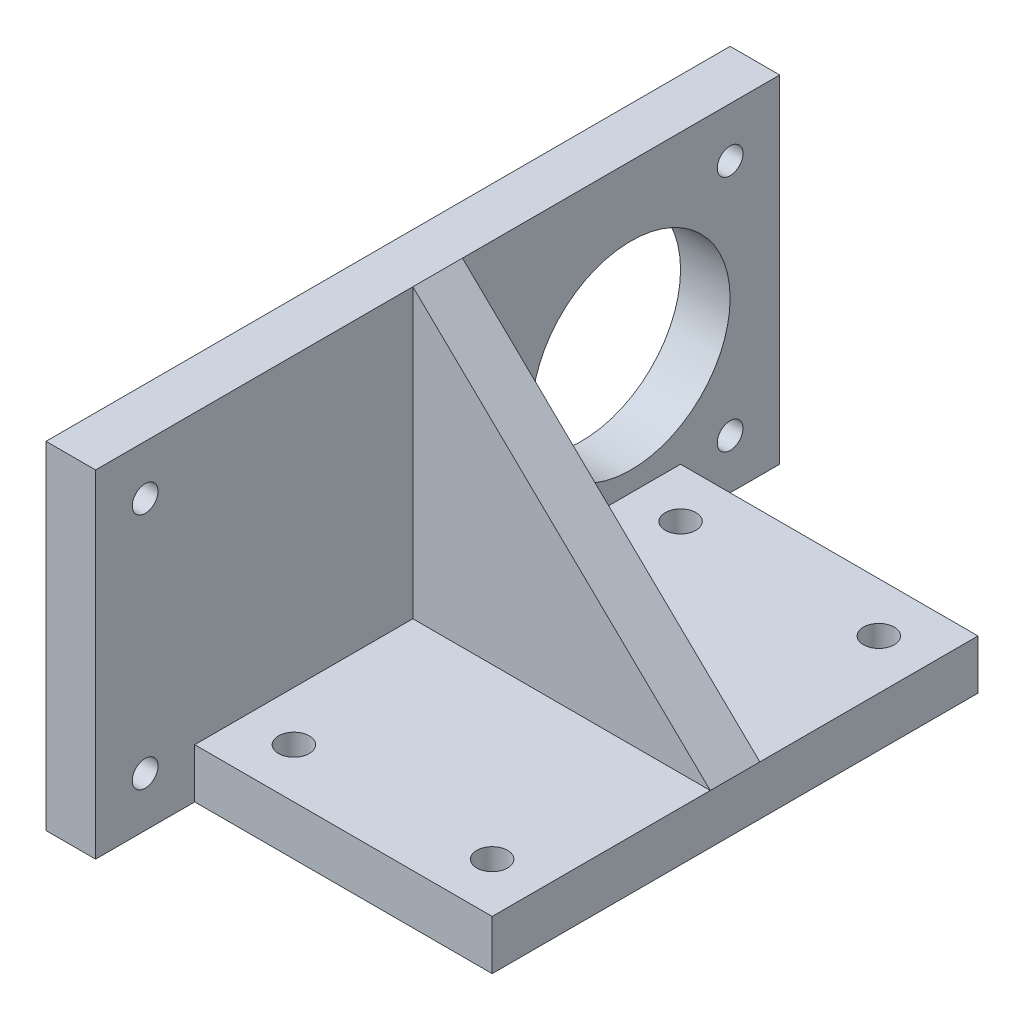
ISO-10303-21;
HEADER;
FILE_DESCRIPTION(('STEP AP214'),'2;1');
FILE_NAME('part.step','',(''),(''),'','','');
FILE_SCHEMA(('AUTOMOTIVE_DESIGN { 1 0 10303 214 1 1 1 1 }'));
ENDSEC;
DATA;
#1=APPLICATION_CONTEXT('core data for automotive mechanical design processes');
#2=APPLICATION_PROTOCOL_DEFINITION('international standard','automotive_design',2000,#1);
#3=PRODUCT_CONTEXT('',#1,'mechanical');
#4=PRODUCT('Part','Part','',(#3));
#5=PRODUCT_RELATED_PRODUCT_CATEGORY('part','',(#4));
#6=PRODUCT_DEFINITION_FORMATION('','',#4);
#7=PRODUCT_DEFINITION_CONTEXT('part definition',#1,'design');
#8=PRODUCT_DEFINITION('design','',#6,#7);
#9=PRODUCT_DEFINITION_SHAPE('','',#8);
#10=(LENGTH_UNIT() NAMED_UNIT(*) SI_UNIT(.MILLI.,.METRE.));
#11=(NAMED_UNIT(*) PLANE_ANGLE_UNIT() SI_UNIT($,.RADIAN.));
#12=(NAMED_UNIT(*) SI_UNIT($,.STERADIAN.) SOLID_ANGLE_UNIT());
#13=UNCERTAINTY_MEASURE_WITH_UNIT(LENGTH_MEASURE(1.E-05),#10,'distance_accuracy_value','');
#14=(GEOMETRIC_REPRESENTATION_CONTEXT(3) GLOBAL_UNCERTAINTY_ASSIGNED_CONTEXT((#13)) GLOBAL_UNIT_ASSIGNED_CONTEXT((#10,
#11,#12)) REPRESENTATION_CONTEXT('',''));
#15=CARTESIAN_POINT('',(0.,0.,0.));
#16=DIRECTION('',(0.,0.,1.));
#17=DIRECTION('',(1.,0.,0.));
#18=AXIS2_PLACEMENT_3D('',#15,#16,#17);
#19=CARTESIAN_POINT('',(5.,0.,0.));
#20=DIRECTION('',(1.,0.,0.));
#21=DIRECTION('',(0.,0.,-1.));
#22=AXIS2_PLACEMENT_3D('',#19,#20,#21);
#23=PLANE('',#22);
#24=CARTESIAN_POINT('',(5.,0.,-19.5));
#25=DIRECTION('',(1.,0.,0.));
#26=DIRECTION('',(0.,0.,-1.));
#27=AXIS2_PLACEMENT_3D('',#24,#25,#26);
#28=CIRCLE('',#27,10.);
#29=CARTESIAN_POINT('',(5.,0.,-29.5));
#30=VERTEX_POINT('',#29);
#31=EDGE_CURVE('E175',#30,#30,#28,.T.);
#32=ORIENTED_EDGE('',*,*,#31,.F.);
#33=EDGE_LOOP('',(#32));
#34=FACE_BOUND('',#33,.T.);
#35=CARTESIAN_POINT('',(5.,12.,-29.5));
#36=DIRECTION('',(1.,0.,0.));
#37=DIRECTION('',(0.,0.,-1.));
#38=AXIS2_PLACEMENT_3D('',#35,#36,#37);
#39=CIRCLE('',#38,1.3);
#40=CARTESIAN_POINT('',(5.,12.,-30.8));
#41=VERTEX_POINT('',#40);
#42=EDGE_CURVE('E191',#41,#41,#39,.T.);
#43=ORIENTED_EDGE('',*,*,#42,.F.);
#44=EDGE_LOOP('',(#43));
#45=FACE_BOUND('',#44,.T.);
#46=CARTESIAN_POINT('',(5.,-12.,-29.5));
#47=DIRECTION('',(1.,0.,0.));
#48=DIRECTION('',(0.,0.,-1.));
#49=AXIS2_PLACEMENT_3D('',#46,#47,#48);
#50=CIRCLE('',#49,1.3);
#51=CARTESIAN_POINT('',(5.,-12.,-30.8));
#52=VERTEX_POINT('',#51);
#53=EDGE_CURVE('E183',#52,#52,#50,.T.);
#54=ORIENTED_EDGE('',*,*,#53,.F.);
#55=EDGE_LOOP('',(#54));
#56=FACE_BOUND('',#55,.T.);
#57=DIRECTION('',(0.,0.,1.));
#58=VECTOR('',#57,1.);
#59=CARTESIAN_POINT('',(5.,17.,34.5));
#60=LINE('',#59,#58);
#61=CARTESIAN_POINT('',(5.,17.,-34.5));
#62=VERTEX_POINT('',#61);
#63=CARTESIAN_POINT('',(5.,17.,-2.5));
#64=VERTEX_POINT('',#63);
#65=EDGE_CURVE('E228',#62,#64,#60,.T.);
#66=ORIENTED_EDGE('',*,*,#65,.T.);
#67=DIRECTION('',(0.,-1.,0.));
#68=VECTOR('',#67,1.);
#69=CARTESIAN_POINT('',(5.,17.,-2.5));
#70=LINE('',#69,#68);
#71=CARTESIAN_POINT('',(5.,-12.,-2.5));
#72=VERTEX_POINT('',#71);
#73=EDGE_CURVE('E309',#64,#72,#70,.T.);
#74=ORIENTED_EDGE('',*,*,#73,.T.);
#75=DIRECTION('',(0.,0.,1.));
#76=VECTOR('',#75,1.);
#77=CARTESIAN_POINT('',(5.,-12.,24.5));
#78=LINE('',#77,#76);
#79=CARTESIAN_POINT('',(5.,-12.,-24.5));
#80=VERTEX_POINT('',#79);
#81=EDGE_CURVE('E147',#80,#72,#78,.T.);
#82=ORIENTED_EDGE('',*,*,#81,.F.);
#83=DIRECTION('',(0.,1.,0.));
#84=VECTOR('',#83,1.);
#85=CARTESIAN_POINT('',(5.,-17.,-24.5));
#86=LINE('',#85,#84);
#87=CARTESIAN_POINT('',(5.,-17.,-24.5));
#88=VERTEX_POINT('',#87);
#89=EDGE_CURVE('E148',#88,#80,#86,.T.);
#90=ORIENTED_EDGE('',*,*,#89,.F.);
#91=DIRECTION('',(0.,0.,-1.));
#92=VECTOR('',#91,1.);
#93=CARTESIAN_POINT('',(5.,-17.,34.5));
#94=LINE('',#93,#92);
#95=CARTESIAN_POINT('',(5.,-17.,-34.5));
#96=VERTEX_POINT('',#95);
#97=EDGE_CURVE('E219',#88,#96,#94,.T.);
#98=ORIENTED_EDGE('',*,*,#97,.T.);
#99=DIRECTION('',(0.,1.,0.));
#100=VECTOR('',#99,1.);
#101=CARTESIAN_POINT('',(5.,17.,-34.5));
#102=LINE('',#101,#100);
#103=EDGE_CURVE('E224',#96,#62,#102,.T.);
#104=ORIENTED_EDGE('',*,*,#103,.T.);
#105=EDGE_LOOP('',(#66,#74,#82,#90,#98,#104));
#106=FACE_BOUND('',#105,.T.);
#107=ADVANCED_FACE('F42',(#34,#45,#56,#106),#23,.T.);
#108=CARTESIAN_POINT('',(35.,-12.,24.5));
#109=DIRECTION('',(0.,-1.,0.));
#110=DIRECTION('',(0.,0.,-1.));
#111=AXIS2_PLACEMENT_3D('',#108,#109,#110);
#112=PLANE('',#111);
#113=CARTESIAN_POINT('',(30.,-12.,-19.5));
#114=DIRECTION('',(0.,-1.,0.));
#115=DIRECTION('',(0.,0.,1.));
#116=AXIS2_PLACEMENT_3D('',#113,#114,#115);
#117=CIRCLE('',#116,1.55);
#118=CARTESIAN_POINT('',(30.,-12.,-17.95));
#119=VERTEX_POINT('',#118);
#120=EDGE_CURVE('E322',#119,#119,#117,.T.);
#121=ORIENTED_EDGE('',*,*,#120,.T.);
#122=EDGE_LOOP('',(#121));
#123=FACE_BOUND('',#122,.T.);
#124=CARTESIAN_POINT('',(9.99999999999999,-12.,-19.5));
#125=DIRECTION('',(0.,-1.,0.));
#126=DIRECTION('',(0.,0.,1.));
#127=AXIS2_PLACEMENT_3D('',#124,#125,#126);
#128=CIRCLE('',#127,1.55);
#129=CARTESIAN_POINT('',(9.99999999999999,-12.,-17.95));
#130=VERTEX_POINT('',#129);
#131=EDGE_CURVE('E330',#130,#130,#128,.T.);
#132=ORIENTED_EDGE('',*,*,#131,.T.);
#133=EDGE_LOOP('',(#132));
#134=FACE_BOUND('',#133,.T.);
#135=DIRECTION('',(1.,0.,0.));
#136=VECTOR('',#135,1.);
#137=CARTESIAN_POINT('',(5.,-12.,-2.5));
#138=LINE('',#137,#136);
#139=CARTESIAN_POINT('',(35.,-12.,-2.5));
#140=VERTEX_POINT('',#139);
#141=EDGE_CURVE('E305',#72,#140,#138,.T.);
#142=ORIENTED_EDGE('',*,*,#141,.T.);
#143=DIRECTION('',(0.,0.,1.));
#144=VECTOR('',#143,1.);
#145=CARTESIAN_POINT('',(35.,-12.,24.5));
#146=LINE('',#145,#144);
#147=CARTESIAN_POINT('',(35.,-12.,-24.5));
#148=VERTEX_POINT('',#147);
#149=EDGE_CURVE('E162',#148,#140,#146,.T.);
#150=ORIENTED_EDGE('',*,*,#149,.F.);
#151=DIRECTION('',(-1.,0.,0.));
#152=VECTOR('',#151,1.);
#153=CARTESIAN_POINT('',(35.,-12.,-24.5));
#154=LINE('',#153,#152);
#155=EDGE_CURVE('E161',#148,#80,#154,.T.);
#156=ORIENTED_EDGE('',*,*,#155,.T.);
#157=ORIENTED_EDGE('',*,*,#81,.T.);
#158=EDGE_LOOP('',(#142,#150,#156,#157));
#159=FACE_BOUND('',#158,.T.);
#160=ADVANCED_FACE('F369',(#123,#134,#159),#112,.F.);
#161=DIRECTION('',(0.,-1.,0.));
#162=VECTOR('',#161,1.);
#163=CARTESIAN_POINT('',(5.,17.,2.5));
#164=LINE('',#163,#162);
#165=CARTESIAN_POINT('',(5.,17.,2.5));
#166=VERTEX_POINT('',#165);
#167=CARTESIAN_POINT('',(5.,-12.,2.5));
#168=VERTEX_POINT('',#167);
#169=EDGE_CURVE('E127',#166,#168,#164,.T.);
#170=ORIENTED_EDGE('',*,*,#169,.F.);
#171=CARTESIAN_POINT('',(5.,17.,34.5));
#172=VERTEX_POINT('',#171);
#173=EDGE_CURVE('E227',#166,#172,#60,.T.);
#174=ORIENTED_EDGE('',*,*,#173,.T.);
#175=DIRECTION('',(0.,-1.,0.));
#176=VECTOR('',#175,1.);
#177=CARTESIAN_POINT('',(5.,17.,34.5));
#178=LINE('',#177,#176);
#179=CARTESIAN_POINT('',(5.,-17.,34.5));
#180=VERTEX_POINT('',#179);
#181=EDGE_CURVE('E215',#172,#180,#178,.T.);
#182=ORIENTED_EDGE('',*,*,#181,.T.);
#183=CARTESIAN_POINT('',(5.,-17.,24.5));
#184=VERTEX_POINT('',#183);
#185=EDGE_CURVE('E221',#180,#184,#94,.T.);
#186=ORIENTED_EDGE('',*,*,#185,.T.);
#187=DIRECTION('',(0.,-1.,0.));
#188=VECTOR('',#187,1.);
#189=CARTESIAN_POINT('',(5.,-17.,24.5));
#190=LINE('',#189,#188);
#191=CARTESIAN_POINT('',(5.,-12.,24.5));
#192=VERTEX_POINT('',#191);
#193=EDGE_CURVE('E144',#192,#184,#190,.T.);
#194=ORIENTED_EDGE('',*,*,#193,.F.);
#195=EDGE_CURVE('E66',#168,#192,#78,.T.);
#196=ORIENTED_EDGE('',*,*,#195,.F.);
#197=EDGE_LOOP('',(#170,#174,#182,#186,#194,#196));
#198=FACE_BOUND('',#197,.T.);
#199=CARTESIAN_POINT('',(5.,-12.,29.5));
#200=DIRECTION('',(1.,0.,0.));
#201=DIRECTION('',(0.,0.,-1.));
#202=AXIS2_PLACEMENT_3D('',#199,#200,#201);
#203=CIRCLE('',#202,1.3);
#204=CARTESIAN_POINT('',(5.,-12.,28.2));
#205=VERTEX_POINT('',#204);
#206=EDGE_CURVE('E199',#205,#205,#203,.T.);
#207=ORIENTED_EDGE('',*,*,#206,.F.);
#208=EDGE_LOOP('',(#207));
#209=FACE_BOUND('',#208,.T.);
#210=CARTESIAN_POINT('',(5.,12.,29.5));
#211=DIRECTION('',(1.,0.,0.));
#212=DIRECTION('',(0.,0.,-1.));
#213=AXIS2_PLACEMENT_3D('',#210,#211,#212);
#214=CIRCLE('',#213,1.3);
#215=CARTESIAN_POINT('',(5.,12.,28.2));
#216=VERTEX_POINT('',#215);
#217=EDGE_CURVE('E207',#216,#216,#214,.T.);
#218=ORIENTED_EDGE('',*,*,#217,.F.);
#219=EDGE_LOOP('',(#218));
#220=FACE_BOUND('',#219,.T.);
#221=ADVANCED_FACE('F141',(#198,#209,#220),#23,.T.);
#222=CARTESIAN_POINT('',(0.,0.,0.));
#223=DIRECTION('',(1.,0.,0.));
#224=DIRECTION('',(0.,0.,-1.));
#225=AXIS2_PLACEMENT_3D('',#222,#223,#224);
#226=PLANE('',#225);
#227=DIRECTION('',(0.,-1.,0.));
#228=VECTOR('',#227,1.);
#229=CARTESIAN_POINT('',(0.,17.,34.5));
#230=LINE('',#229,#228);
#231=CARTESIAN_POINT('',(0.,17.,34.5));
#232=VERTEX_POINT('',#231);
#233=CARTESIAN_POINT('',(0.,-17.,34.5));
#234=VERTEX_POINT('',#233);
#235=EDGE_CURVE('E211',#232,#234,#230,.T.);
#236=ORIENTED_EDGE('',*,*,#235,.F.);
#237=DIRECTION('',(0.,0.,1.));
#238=VECTOR('',#237,1.);
#239=CARTESIAN_POINT('',(0.,17.,34.5));
#240=LINE('',#239,#238);
#241=CARTESIAN_POINT('',(0.,17.,-34.5));
#242=VERTEX_POINT('',#241);
#243=EDGE_CURVE('E220',#242,#232,#240,.T.);
#244=ORIENTED_EDGE('',*,*,#243,.F.);
#245=DIRECTION('',(0.,1.,0.));
#246=VECTOR('',#245,1.);
#247=CARTESIAN_POINT('',(0.,17.,-34.5));
#248=LINE('',#247,#246);
#249=CARTESIAN_POINT('',(0.,-17.,-34.5));
#250=VERTEX_POINT('',#249);
#251=EDGE_CURVE('E239',#250,#242,#248,.T.);
#252=ORIENTED_EDGE('',*,*,#251,.F.);
#253=DIRECTION('',(0.,0.,-1.));
#254=VECTOR('',#253,1.);
#255=CARTESIAN_POINT('',(0.,-17.,34.5));
#256=LINE('',#255,#254);
#257=EDGE_CURVE('E236',#234,#250,#256,.T.);
#258=ORIENTED_EDGE('',*,*,#257,.F.);
#259=EDGE_LOOP('',(#236,#244,#252,#258));
#260=FACE_BOUND('',#259,.T.);
#261=CARTESIAN_POINT('',(0.,12.,29.5));
#262=DIRECTION('',(1.,0.,0.));
#263=DIRECTION('',(0.,0.,-1.));
#264=AXIS2_PLACEMENT_3D('',#261,#262,#263);
#265=CIRCLE('',#264,1.3);
#266=CARTESIAN_POINT('',(0.,12.,28.2));
#267=VERTEX_POINT('',#266);
#268=EDGE_CURVE('E203',#267,#267,#265,.T.);
#269=ORIENTED_EDGE('',*,*,#268,.T.);
#270=EDGE_LOOP('',(#269));
#271=FACE_BOUND('',#270,.T.);
#272=CARTESIAN_POINT('',(0.,-12.,29.5));
#273=DIRECTION('',(1.,0.,0.));
#274=DIRECTION('',(0.,0.,-1.));
#275=AXIS2_PLACEMENT_3D('',#272,#273,#274);
#276=CIRCLE('',#275,1.3);
#277=CARTESIAN_POINT('',(0.,-12.,28.2));
#278=VERTEX_POINT('',#277);
#279=EDGE_CURVE('E195',#278,#278,#276,.T.);
#280=ORIENTED_EDGE('',*,*,#279,.T.);
#281=EDGE_LOOP('',(#280));
#282=FACE_BOUND('',#281,.T.);
#283=CARTESIAN_POINT('',(0.,12.,-29.5));
#284=DIRECTION('',(1.,0.,0.));
#285=DIRECTION('',(0.,0.,-1.));
#286=AXIS2_PLACEMENT_3D('',#283,#284,#285);
#287=CIRCLE('',#286,1.3);
#288=CARTESIAN_POINT('',(0.,12.,-30.8));
#289=VERTEX_POINT('',#288);
#290=EDGE_CURVE('E187',#289,#289,#287,.T.);
#291=ORIENTED_EDGE('',*,*,#290,.T.);
#292=EDGE_LOOP('',(#291));
#293=FACE_BOUND('',#292,.T.);
#294=CARTESIAN_POINT('',(0.,-12.,-29.5));
#295=DIRECTION('',(1.,0.,0.));
#296=DIRECTION('',(0.,0.,-1.));
#297=AXIS2_PLACEMENT_3D('',#294,#295,#296);
#298=CIRCLE('',#297,1.3);
#299=CARTESIAN_POINT('',(0.,-12.,-30.8));
#300=VERTEX_POINT('',#299);
#301=EDGE_CURVE('E179',#300,#300,#298,.T.);
#302=ORIENTED_EDGE('',*,*,#301,.T.);
#303=EDGE_LOOP('',(#302));
#304=FACE_BOUND('',#303,.T.);
#305=CARTESIAN_POINT('',(0.,0.,-19.5));
#306=DIRECTION('',(1.,0.,0.));
#307=DIRECTION('',(0.,0.,-1.));
#308=AXIS2_PLACEMENT_3D('',#305,#306,#307);
#309=CIRCLE('',#308,10.);
#310=CARTESIAN_POINT('',(0.,0.,-29.5));
#311=VERTEX_POINT('',#310);
#312=EDGE_CURVE('E174',#311,#311,#309,.T.);
#313=ORIENTED_EDGE('',*,*,#312,.T.);
#314=EDGE_LOOP('',(#313));
#315=FACE_BOUND('',#314,.T.);
#316=ADVANCED_FACE('F263',(#260,#271,#282,#293,#304,#315),#226,.F.);
#317=CARTESIAN_POINT('',(5.,17.,34.5));
#318=DIRECTION('',(0.,0.,-1.));
#319=DIRECTION('',(0.,1.,0.));
#320=AXIS2_PLACEMENT_3D('',#317,#318,#319);
#321=PLANE('',#320);
#322=ORIENTED_EDGE('',*,*,#235,.T.);
#323=DIRECTION('',(-1.,0.,0.));
#324=VECTOR('',#323,1.);
#325=CARTESIAN_POINT('',(5.,-17.,34.5));
#326=LINE('',#325,#324);
#327=EDGE_CURVE('E11',#180,#234,#326,.T.);
#328=ORIENTED_EDGE('',*,*,#327,.F.);
#329=ORIENTED_EDGE('',*,*,#181,.F.);
#330=DIRECTION('',(-1.,0.,0.));
#331=VECTOR('',#330,1.);
#332=CARTESIAN_POINT('',(5.,17.,34.5));
#333=LINE('',#332,#331);
#334=EDGE_CURVE('E232',#172,#232,#333,.T.);
#335=ORIENTED_EDGE('',*,*,#334,.T.);
#336=EDGE_LOOP('',(#322,#328,#329,#335));
#337=FACE_BOUND('',#336,.T.);
#338=ADVANCED_FACE('F44',(#337),#321,.F.);
#339=CARTESIAN_POINT('',(5.,-17.,34.5));
#340=DIRECTION('',(0.,1.,0.));
#341=DIRECTION('',(0.,0.,1.));
#342=AXIS2_PLACEMENT_3D('',#339,#340,#341);
#343=PLANE('',#342);
#344=CARTESIAN_POINT('',(30.,-17.,-19.5));
#345=DIRECTION('',(0.,-1.,0.));
#346=DIRECTION('',(0.,0.,1.));
#347=AXIS2_PLACEMENT_3D('',#344,#345,#346);
#348=CIRCLE('',#347,1.55);
#349=CARTESIAN_POINT('',(30.,-17.,-17.95));
#350=VERTEX_POINT('',#349);
#351=EDGE_CURVE('E326',#350,#350,#348,.T.);
#352=ORIENTED_EDGE('',*,*,#351,.F.);
#353=EDGE_LOOP('',(#352));
#354=FACE_BOUND('',#353,.T.);
#355=CARTESIAN_POINT('',(9.99999999999999,-17.,-19.5));
#356=DIRECTION('',(0.,-1.,0.));
#357=DIRECTION('',(0.,0.,1.));
#358=AXIS2_PLACEMENT_3D('',#355,#356,#357);
#359=CIRCLE('',#358,1.55);
#360=CARTESIAN_POINT('',(9.99999999999999,-17.,-17.95));
#361=VERTEX_POINT('',#360);
#362=EDGE_CURVE('E334',#361,#361,#359,.T.);
#363=ORIENTED_EDGE('',*,*,#362,.F.);
#364=EDGE_LOOP('',(#363));
#365=FACE_BOUND('',#364,.T.);
#366=CARTESIAN_POINT('',(9.99999999999999,-17.,19.5));
#367=DIRECTION('',(0.,-1.,0.));
#368=DIRECTION('',(0.,0.,-1.));
#369=AXIS2_PLACEMENT_3D('',#366,#367,#368);
#370=CIRCLE('',#369,1.55);
#371=CARTESIAN_POINT('',(9.99999999999999,-17.,17.95));
#372=VERTEX_POINT('',#371);
#373=EDGE_CURVE('E318',#372,#372,#370,.T.);
#374=ORIENTED_EDGE('',*,*,#373,.F.);
#375=EDGE_LOOP('',(#374));
#376=FACE_BOUND('',#375,.T.);
#377=CARTESIAN_POINT('',(30.,-17.,19.5));
#378=DIRECTION('',(0.,-1.,0.));
#379=DIRECTION('',(0.,0.,-1.));
#380=AXIS2_PLACEMENT_3D('',#377,#378,#379);
#381=CIRCLE('',#380,1.55);
#382=CARTESIAN_POINT('',(30.,-17.,17.95));
#383=VERTEX_POINT('',#382);
#384=EDGE_CURVE('E314',#383,#383,#381,.T.);
#385=ORIENTED_EDGE('',*,*,#384,.F.);
#386=EDGE_LOOP('',(#385));
#387=FACE_BOUND('',#386,.T.);
#388=ORIENTED_EDGE('',*,*,#257,.T.);
#389=DIRECTION('',(-1.,0.,0.));
#390=VECTOR('',#389,1.);
#391=CARTESIAN_POINT('',(5.,-17.,-34.5));
#392=LINE('',#391,#390);
#393=EDGE_CURVE('E51',#96,#250,#392,.T.);
#394=ORIENTED_EDGE('',*,*,#393,.F.);
#395=ORIENTED_EDGE('',*,*,#97,.F.);
#396=DIRECTION('',(-1.,0.,0.));
#397=VECTOR('',#396,1.);
#398=CARTESIAN_POINT('',(35.,-17.,-24.5));
#399=LINE('',#398,#397);
#400=CARTESIAN_POINT('',(35.,-17.,-24.5));
#401=VERTEX_POINT('',#400);
#402=EDGE_CURVE('E166',#401,#88,#399,.T.);
#403=ORIENTED_EDGE('',*,*,#402,.F.);
#404=DIRECTION('',(0.,0.,-1.));
#405=VECTOR('',#404,1.);
#406=CARTESIAN_POINT('',(35.,-17.,24.5));
#407=LINE('',#406,#405);
#408=CARTESIAN_POINT('',(35.,-17.,24.5));
#409=VERTEX_POINT('',#408);
#410=EDGE_CURVE('E282',#409,#401,#407,.T.);
#411=ORIENTED_EDGE('',*,*,#410,.F.);
#412=DIRECTION('',(-1.,0.,0.));
#413=VECTOR('',#412,1.);
#414=CARTESIAN_POINT('',(35.,-17.,24.5));
#415=LINE('',#414,#413);
#416=EDGE_CURVE('E170',#409,#184,#415,.T.);
#417=ORIENTED_EDGE('',*,*,#416,.T.);
#418=ORIENTED_EDGE('',*,*,#185,.F.);
#419=ORIENTED_EDGE('',*,*,#327,.T.);
#420=EDGE_LOOP('',(#388,#394,#395,#403,#411,#417,#418,#419));
#421=FACE_BOUND('',#420,.T.);
#422=ADVANCED_FACE('F348',(#354,#365,#376,#387,#421),#343,.F.);
#423=CARTESIAN_POINT('',(5.,17.,-34.5));
#424=DIRECTION('',(0.,0.,1.));
#425=DIRECTION('',(0.,-1.,0.));
#426=AXIS2_PLACEMENT_3D('',#423,#424,#425);
#427=PLANE('',#426);
#428=ORIENTED_EDGE('',*,*,#251,.T.);
#429=DIRECTION('',(-1.,0.,0.));
#430=VECTOR('',#429,1.);
#431=CARTESIAN_POINT('',(5.,17.,-34.5));
#432=LINE('',#431,#430);
#433=EDGE_CURVE('E247',#62,#242,#432,.T.);
#434=ORIENTED_EDGE('',*,*,#433,.F.);
#435=ORIENTED_EDGE('',*,*,#103,.F.);
#436=ORIENTED_EDGE('',*,*,#393,.T.);
#437=EDGE_LOOP('',(#428,#434,#435,#436));
#438=FACE_BOUND('',#437,.T.);
#439=ADVANCED_FACE('F256',(#438),#427,.F.);
#440=CARTESIAN_POINT('',(5.,17.,34.5));
#441=DIRECTION('',(0.,-1.,0.));
#442=DIRECTION('',(0.,0.,-1.));
#443=AXIS2_PLACEMENT_3D('',#440,#441,#442);
#444=PLANE('',#443);
#445=ORIENTED_EDGE('',*,*,#243,.T.);
#446=ORIENTED_EDGE('',*,*,#334,.F.);
#447=ORIENTED_EDGE('',*,*,#173,.F.);
#448=DIRECTION('',(0.,0.,-1.));
#449=VECTOR('',#448,1.);
#450=CARTESIAN_POINT('',(5.,17.,2.5));
#451=LINE('',#450,#449);
#452=EDGE_CURVE('E297',#166,#64,#451,.T.);
#453=ORIENTED_EDGE('',*,*,#452,.T.);
#454=ORIENTED_EDGE('',*,*,#65,.F.);
#455=ORIENTED_EDGE('',*,*,#433,.T.);
#456=EDGE_LOOP('',(#445,#446,#447,#453,#454,#455));
#457=FACE_BOUND('',#456,.T.);
#458=ADVANCED_FACE('F267',(#457),#444,.F.);
#459=CARTESIAN_POINT('',(5.,12.,29.5));
#460=DIRECTION('',(-1.,0.,0.));
#461=DIRECTION('',(0.,0.,1.));
#462=AXIS2_PLACEMENT_3D('',#459,#460,#461);
#463=CYLINDRICAL_SURFACE('',#462,1.3);
#464=ORIENTED_EDGE('',*,*,#217,.T.);
#465=EDGE_LOOP('',(#464));
#466=FACE_BOUND('',#465,.T.);
#467=ORIENTED_EDGE('',*,*,#268,.F.);
#468=EDGE_LOOP('',(#467));
#469=FACE_BOUND('',#468,.T.);
#470=ADVANCED_FACE('F391',(#466,#469),#463,.F.);
#471=CARTESIAN_POINT('',(5.,-12.,29.5));
#472=DIRECTION('',(-1.,0.,0.));
#473=DIRECTION('',(0.,0.,1.));
#474=AXIS2_PLACEMENT_3D('',#471,#472,#473);
#475=CYLINDRICAL_SURFACE('',#474,1.3);
#476=ORIENTED_EDGE('',*,*,#206,.T.);
#477=EDGE_LOOP('',(#476));
#478=FACE_BOUND('',#477,.T.);
#479=ORIENTED_EDGE('',*,*,#279,.F.);
#480=EDGE_LOOP('',(#479));
#481=FACE_BOUND('',#480,.T.);
#482=ADVANCED_FACE('F409',(#478,#481),#475,.F.);
#483=CARTESIAN_POINT('',(5.,12.,-29.5));
#484=DIRECTION('',(-1.,0.,0.));
#485=DIRECTION('',(0.,0.,1.));
#486=AXIS2_PLACEMENT_3D('',#483,#484,#485);
#487=CYLINDRICAL_SURFACE('',#486,1.3);
#488=ORIENTED_EDGE('',*,*,#42,.T.);
#489=EDGE_LOOP('',(#488));
#490=FACE_BOUND('',#489,.T.);
#491=ORIENTED_EDGE('',*,*,#290,.F.);
#492=EDGE_LOOP('',(#491));
#493=FACE_BOUND('',#492,.T.);
#494=ADVANCED_FACE('F416',(#490,#493),#487,.F.);
#495=CARTESIAN_POINT('',(5.,-12.,-29.5));
#496=DIRECTION('',(-1.,0.,0.));
#497=DIRECTION('',(0.,0.,1.));
#498=AXIS2_PLACEMENT_3D('',#495,#496,#497);
#499=CYLINDRICAL_SURFACE('',#498,1.3);
#500=ORIENTED_EDGE('',*,*,#53,.T.);
#501=EDGE_LOOP('',(#500));
#502=FACE_BOUND('',#501,.T.);
#503=ORIENTED_EDGE('',*,*,#301,.F.);
#504=EDGE_LOOP('',(#503));
#505=FACE_BOUND('',#504,.T.);
#506=ADVANCED_FACE('F365',(#502,#505),#499,.F.);
#507=CARTESIAN_POINT('',(5.,0.,-19.5));
#508=DIRECTION('',(-1.,0.,0.));
#509=DIRECTION('',(0.,0.,1.));
#510=AXIS2_PLACEMENT_3D('',#507,#508,#509);
#511=CYLINDRICAL_SURFACE('',#510,10.);
#512=ORIENTED_EDGE('',*,*,#31,.T.);
#513=EDGE_LOOP('',(#512));
#514=FACE_BOUND('',#513,.T.);
#515=ORIENTED_EDGE('',*,*,#312,.F.);
#516=EDGE_LOOP('',(#515));
#517=FACE_BOUND('',#516,.T.);
#518=ADVANCED_FACE('F357',(#514,#517),#511,.F.);
#519=CARTESIAN_POINT('',(35.,-17.,24.5));
#520=DIRECTION('',(0.,0.,-1.));
#521=DIRECTION('',(-1.,0.,0.));
#522=AXIS2_PLACEMENT_3D('',#519,#520,#521);
#523=PLANE('',#522);
#524=ORIENTED_EDGE('',*,*,#193,.T.);
#525=ORIENTED_EDGE('',*,*,#416,.F.);
#526=DIRECTION('',(0.,-1.,0.));
#527=VECTOR('',#526,1.);
#528=CARTESIAN_POINT('',(35.,-17.,24.5));
#529=LINE('',#528,#527);
#530=CARTESIAN_POINT('',(35.,-12.,24.5));
#531=VERTEX_POINT('',#530);
#532=EDGE_CURVE('E153',#531,#409,#529,.T.);
#533=ORIENTED_EDGE('',*,*,#532,.F.);
#534=DIRECTION('',(-1.,0.,0.));
#535=VECTOR('',#534,1.);
#536=CARTESIAN_POINT('',(35.,-12.,24.5));
#537=LINE('',#536,#535);
#538=EDGE_CURVE('E158',#531,#192,#537,.T.);
#539=ORIENTED_EDGE('',*,*,#538,.T.);
#540=EDGE_LOOP('',(#524,#525,#533,#539));
#541=FACE_BOUND('',#540,.T.);
#542=ADVANCED_FACE('F354',(#541),#523,.F.);
#543=CARTESIAN_POINT('',(35.,-17.,-24.5));
#544=DIRECTION('',(0.,0.,1.));
#545=DIRECTION('',(1.,0.,0.));
#546=AXIS2_PLACEMENT_3D('',#543,#544,#545);
#547=PLANE('',#546);
#548=ORIENTED_EDGE('',*,*,#89,.T.);
#549=ORIENTED_EDGE('',*,*,#155,.F.);
#550=DIRECTION('',(0.,1.,0.));
#551=VECTOR('',#550,1.);
#552=CARTESIAN_POINT('',(35.,-17.,-24.5));
#553=LINE('',#552,#551);
#554=EDGE_CURVE('E280',#401,#148,#553,.T.);
#555=ORIENTED_EDGE('',*,*,#554,.F.);
#556=ORIENTED_EDGE('',*,*,#402,.T.);
#557=EDGE_LOOP('',(#548,#549,#555,#556));
#558=FACE_BOUND('',#557,.T.);
#559=ADVANCED_FACE('F356',(#558),#547,.F.);
#560=CARTESIAN_POINT('',(9.99999999999999,-12.,19.5));
#561=DIRECTION('',(0.,-1.,0.));
#562=DIRECTION('',(0.,0.,-1.));
#563=AXIS2_PLACEMENT_3D('',#560,#561,#562);
#564=CIRCLE('',#563,1.55);
#565=CARTESIAN_POINT('',(9.99999999999999,-12.,17.95));
#566=VERTEX_POINT('',#565);
#567=EDGE_CURVE('E338',#566,#566,#564,.T.);
#568=ORIENTED_EDGE('',*,*,#567,.T.);
#569=EDGE_LOOP('',(#568));
#570=FACE_BOUND('',#569,.T.);
#571=CARTESIAN_POINT('',(30.,-12.,19.5));
#572=DIRECTION('',(0.,-1.,0.));
#573=DIRECTION('',(0.,0.,-1.));
#574=AXIS2_PLACEMENT_3D('',#571,#572,#573);
#575=CIRCLE('',#574,1.55);
#576=CARTESIAN_POINT('',(30.,-12.,17.95));
#577=VERTEX_POINT('',#576);
#578=EDGE_CURVE('E312',#577,#577,#575,.T.);
#579=ORIENTED_EDGE('',*,*,#578,.T.);
#580=EDGE_LOOP('',(#579));
#581=FACE_BOUND('',#580,.T.);
#582=CARTESIAN_POINT('',(35.,-12.,2.5));
#583=VERTEX_POINT('',#582);
#584=EDGE_CURVE('E137',#583,#531,#146,.T.);
#585=ORIENTED_EDGE('',*,*,#584,.F.);
#586=DIRECTION('',(1.,0.,0.));
#587=VECTOR('',#586,1.);
#588=CARTESIAN_POINT('',(5.,-12.,2.5));
#589=LINE('',#588,#587);
#590=EDGE_CURVE('E129',#168,#583,#589,.T.);
#591=ORIENTED_EDGE('',*,*,#590,.F.);
#592=ORIENTED_EDGE('',*,*,#195,.T.);
#593=ORIENTED_EDGE('',*,*,#538,.F.);
#594=EDGE_LOOP('',(#585,#591,#592,#593));
#595=FACE_BOUND('',#594,.T.);
#596=ADVANCED_FACE('F136',(#570,#581,#595),#112,.F.);
#597=CARTESIAN_POINT('',(35.,0.,0.));
#598=DIRECTION('',(-1.,0.,0.));
#599=DIRECTION('',(0.,0.,1.));
#600=AXIS2_PLACEMENT_3D('',#597,#598,#599);
#601=PLANE('',#600);
#602=ORIENTED_EDGE('',*,*,#532,.T.);
#603=ORIENTED_EDGE('',*,*,#410,.T.);
#604=ORIENTED_EDGE('',*,*,#554,.T.);
#605=ORIENTED_EDGE('',*,*,#149,.T.);
#606=DIRECTION('',(0.,0.,-1.));
#607=VECTOR('',#606,1.);
#608=CARTESIAN_POINT('',(35.,-12.,2.5));
#609=LINE('',#608,#607);
#610=EDGE_CURVE('E292',#583,#140,#609,.T.);
#611=ORIENTED_EDGE('',*,*,#610,.F.);
#612=ORIENTED_EDGE('',*,*,#584,.T.);
#613=EDGE_LOOP('',(#602,#603,#604,#605,#611,#612));
#614=FACE_BOUND('',#613,.T.);
#615=ADVANCED_FACE('F517',(#614),#601,.F.);
#616=CARTESIAN_POINT('',(35.,-12.,2.5));
#617=DIRECTION('',(-0.695022096847475,-0.718988376049112,0.));
#618=DIRECTION('',(0.718988376049112,-0.695022096847475,0.));
#619=AXIS2_PLACEMENT_3D('',#616,#617,#618);
#620=PLANE('',#619);
#621=DIRECTION('',(-0.718988376049112,0.695022096847475,0.));
#622=VECTOR('',#621,1.);
#623=CARTESIAN_POINT('',(35.,-12.,-2.5));
#624=LINE('',#623,#622);
#625=EDGE_CURVE('E134',#140,#64,#624,.T.);
#626=ORIENTED_EDGE('',*,*,#625,.T.);
#627=ORIENTED_EDGE('',*,*,#452,.F.);
#628=DIRECTION('',(-0.718988376049112,0.695022096847475,0.));
#629=VECTOR('',#628,1.);
#630=CARTESIAN_POINT('',(35.,-12.,2.5));
#631=LINE('',#630,#629);
#632=EDGE_CURVE('E58',#583,#166,#631,.T.);
#633=ORIENTED_EDGE('',*,*,#632,.F.);
#634=ORIENTED_EDGE('',*,*,#610,.T.);
#635=EDGE_LOOP('',(#626,#627,#633,#634));
#636=FACE_BOUND('',#635,.T.);
#637=ADVANCED_FACE('F525',(#636),#620,.F.);
#638=CARTESIAN_POINT('',(0.,0.,2.5));
#639=DIRECTION('',(0.,0.,1.));
#640=DIRECTION('',(1.,0.,0.));
#641=AXIS2_PLACEMENT_3D('',#638,#639,#640);
#642=PLANE('',#641);
#643=ORIENTED_EDGE('',*,*,#169,.T.);
#644=ORIENTED_EDGE('',*,*,#590,.T.);
#645=ORIENTED_EDGE('',*,*,#632,.T.);
#646=EDGE_LOOP('',(#643,#644,#645));
#647=FACE_BOUND('',#646,.T.);
#648=ADVANCED_FACE('F128',(#647),#642,.T.);
#649=CARTESIAN_POINT('',(0.,0.,-2.5));
#650=DIRECTION('',(0.,0.,1.));
#651=DIRECTION('',(1.,0.,0.));
#652=AXIS2_PLACEMENT_3D('',#649,#650,#651);
#653=PLANE('',#652);
#654=ORIENTED_EDGE('',*,*,#73,.F.);
#655=ORIENTED_EDGE('',*,*,#625,.F.);
#656=ORIENTED_EDGE('',*,*,#141,.F.);
#657=EDGE_LOOP('',(#654,#655,#656));
#658=FACE_BOUND('',#657,.T.);
#659=ADVANCED_FACE('F537',(#658),#653,.F.);
#660=CARTESIAN_POINT('',(30.,-12.,19.5));
#661=DIRECTION('',(0.,-1.,0.));
#662=DIRECTION('',(0.,0.,-1.));
#663=AXIS2_PLACEMENT_3D('',#660,#661,#662);
#664=CYLINDRICAL_SURFACE('',#663,1.55);
#665=ORIENTED_EDGE('',*,*,#578,.F.);
#666=EDGE_LOOP('',(#665));
#667=FACE_BOUND('',#666,.T.);
#668=ORIENTED_EDGE('',*,*,#384,.T.);
#669=EDGE_LOOP('',(#668));
#670=FACE_BOUND('',#669,.T.);
#671=ADVANCED_FACE('F546',(#667,#670),#664,.F.);
#672=CARTESIAN_POINT('',(9.99999999999999,-12.,19.5));
#673=DIRECTION('',(0.,-1.,0.));
#674=DIRECTION('',(0.,0.,-1.));
#675=AXIS2_PLACEMENT_3D('',#672,#673,#674);
#676=CYLINDRICAL_SURFACE('',#675,1.55);
#677=ORIENTED_EDGE('',*,*,#567,.F.);
#678=EDGE_LOOP('',(#677));
#679=FACE_BOUND('',#678,.T.);
#680=ORIENTED_EDGE('',*,*,#373,.T.);
#681=EDGE_LOOP('',(#680));
#682=FACE_BOUND('',#681,.T.);
#683=ADVANCED_FACE('F346',(#679,#682),#676,.F.);
#684=CARTESIAN_POINT('',(9.99999999999999,-12.,-19.5));
#685=DIRECTION('',(0.,-1.,0.));
#686=DIRECTION('',(0.,0.,-1.));
#687=AXIS2_PLACEMENT_3D('',#684,#685,#686);
#688=CYLINDRICAL_SURFACE('',#687,1.55);
#689=ORIENTED_EDGE('',*,*,#131,.F.);
#690=EDGE_LOOP('',(#689));
#691=FACE_BOUND('',#690,.T.);
#692=ORIENTED_EDGE('',*,*,#362,.T.);
#693=EDGE_LOOP('',(#692));
#694=FACE_BOUND('',#693,.T.);
#695=ADVANCED_FACE('F561',(#691,#694),#688,.F.);
#696=CARTESIAN_POINT('',(30.,-12.,-19.5));
#697=DIRECTION('',(0.,-1.,0.));
#698=DIRECTION('',(0.,0.,-1.));
#699=AXIS2_PLACEMENT_3D('',#696,#697,#698);
#700=CYLINDRICAL_SURFACE('',#699,1.55);
#701=ORIENTED_EDGE('',*,*,#120,.F.);
#702=EDGE_LOOP('',(#701));
#703=FACE_BOUND('',#702,.T.);
#704=ORIENTED_EDGE('',*,*,#351,.T.);
#705=EDGE_LOOP('',(#704));
#706=FACE_BOUND('',#705,.T.);
#707=ADVANCED_FACE('F572',(#703,#706),#700,.F.);
#708=CLOSED_SHELL('',(#107,#160,#221,#316,#338,#422,#439,#458,#470,#482,#494,#506,#518,#542,
#559,#596,#615,#637,#648,#659,#671,#683,#695,#707));
#709=MANIFOLD_SOLID_BREP('B2',#708);
#710=ADVANCED_BREP_SHAPE_REPRESENTATION('',(#18,#709),#14);
#711=SHAPE_DEFINITION_REPRESENTATION(#9,#710);
ENDSEC;
END-ISO-10303-21;
